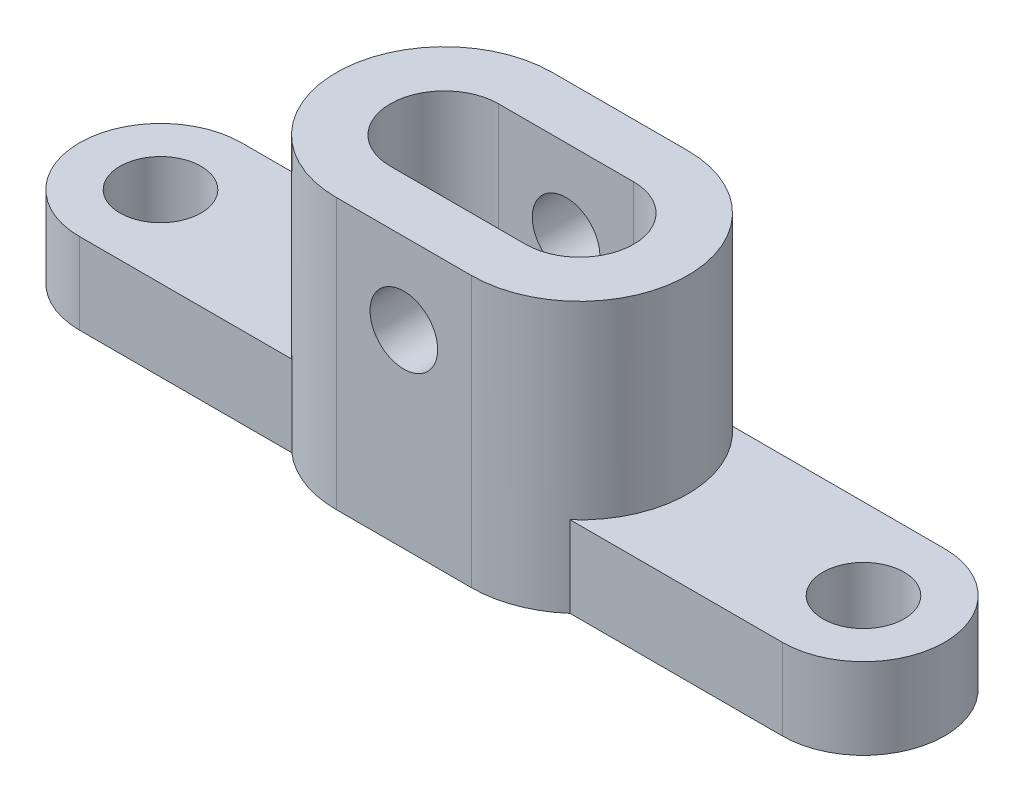
ISO-10303-21;
HEADER;
FILE_DESCRIPTION(('STEP AP214'),'2;1');
FILE_NAME('part.step','',(''),(''),'','','');
FILE_SCHEMA(('AUTOMOTIVE_DESIGN { 1 0 10303 214 1 1 1 1 }'));
ENDSEC;
DATA;
#1=APPLICATION_CONTEXT('core data for automotive mechanical design processes');
#2=APPLICATION_PROTOCOL_DEFINITION('international standard','automotive_design',2000,#1);
#3=PRODUCT_CONTEXT('',#1,'mechanical');
#4=PRODUCT('Part','Part','',(#3));
#5=PRODUCT_RELATED_PRODUCT_CATEGORY('part','',(#4));
#6=PRODUCT_DEFINITION_FORMATION('','',#4);
#7=PRODUCT_DEFINITION_CONTEXT('part definition',#1,'design');
#8=PRODUCT_DEFINITION('design','',#6,#7);
#9=PRODUCT_DEFINITION_SHAPE('','',#8);
#10=(LENGTH_UNIT() NAMED_UNIT(*) SI_UNIT(.MILLI.,.METRE.));
#11=(NAMED_UNIT(*) PLANE_ANGLE_UNIT() SI_UNIT($,.RADIAN.));
#12=(NAMED_UNIT(*) SI_UNIT($,.STERADIAN.) SOLID_ANGLE_UNIT());
#13=UNCERTAINTY_MEASURE_WITH_UNIT(LENGTH_MEASURE(1.E-05),#10,'distance_accuracy_value','');
#14=(GEOMETRIC_REPRESENTATION_CONTEXT(3) GLOBAL_UNCERTAINTY_ASSIGNED_CONTEXT((#13)) GLOBAL_UNIT_ASSIGNED_CONTEXT((#10,
#11,#12)) REPRESENTATION_CONTEXT('',''));
#15=CARTESIAN_POINT('',(0.,0.,0.));
#16=DIRECTION('',(0.,0.,1.));
#17=DIRECTION('',(1.,0.,0.));
#18=AXIS2_PLACEMENT_3D('',#15,#16,#17);
#19=CARTESIAN_POINT('',(13.,7.,4.));
#20=DIRECTION('',(0.,0.,-1.));
#21=DIRECTION('',(-1.,0.,0.));
#22=AXIS2_PLACEMENT_3D('',#19,#20,#21);
#23=CYLINDRICAL_SURFACE('',#22,1.25);
#24=CARTESIAN_POINT('',(13.,7.,-2.));
#25=DIRECTION('',(0.,0.,-1.));
#26=DIRECTION('',(-1.,0.,0.));
#27=AXIS2_PLACEMENT_3D('',#24,#25,#26);
#28=CIRCLE('',#27,1.25);
#29=CARTESIAN_POINT('',(11.75,7.,-2.));
#30=VERTEX_POINT('',#29);
#31=EDGE_CURVE('E40',#30,#30,#28,.F.);
#32=ORIENTED_EDGE('',*,*,#31,.T.);
#33=EDGE_LOOP('',(#32));
#34=FACE_BOUND('',#33,.T.);
#35=CARTESIAN_POINT('',(13.,7.,-4.));
#36=DIRECTION('',(0.,0.,-1.));
#37=DIRECTION('',(-1.,0.,0.));
#38=AXIS2_PLACEMENT_3D('',#35,#36,#37);
#39=CIRCLE('',#38,1.25);
#40=CARTESIAN_POINT('',(11.75,7.,-4.));
#41=VERTEX_POINT('',#40);
#42=EDGE_CURVE('E193',#41,#41,#39,.T.);
#43=ORIENTED_EDGE('',*,*,#42,.T.);
#44=EDGE_LOOP('',(#43));
#45=FACE_BOUND('',#44,.T.);
#46=ADVANCED_FACE('F36',(#34,#45),#23,.F.);
#47=CARTESIAN_POINT('',(0.,3.,0.));
#48=DIRECTION('',(0.,1.,0.));
#49=DIRECTION('',(0.,0.,1.));
#50=AXIS2_PLACEMENT_3D('',#47,#48,#49);
#51=PLANE('',#50);
#52=CARTESIAN_POINT('',(10.5,3.,0.));
#53=DIRECTION('',(0.,1.,0.));
#54=DIRECTION('',(0.,0.,1.));
#55=AXIS2_PLACEMENT_3D('',#52,#53,#54);
#56=CIRCLE('',#55,4.);
#57=CARTESIAN_POINT('',(7.8542486889354,3.,-3.));
#58=VERTEX_POINT('',#57);
#59=CARTESIAN_POINT('',(7.8542486889354,3.,3.));
#60=VERTEX_POINT('',#59);
#61=EDGE_CURVE('E236',#58,#60,#56,.T.);
#62=ORIENTED_EDGE('',*,*,#61,.F.);
#63=DIRECTION('',(-1.,0.,0.));
#64=VECTOR('',#63,1.);
#65=CARTESIAN_POINT('',(0.,3.,-3.));
#66=LINE('',#65,#64);
#67=CARTESIAN_POINT('',(0.,3.,-3.));
#68=VERTEX_POINT('',#67);
#69=EDGE_CURVE('E264',#58,#68,#66,.T.);
#70=ORIENTED_EDGE('',*,*,#69,.T.);
#71=CARTESIAN_POINT('',(0.,3.,0.));
#72=DIRECTION('',(0.,1.,0.));
#73=DIRECTION('',(0.,0.,1.));
#74=AXIS2_PLACEMENT_3D('',#71,#72,#73);
#75=CIRCLE('',#74,3.);
#76=CARTESIAN_POINT('',(0.,3.,3.));
#77=VERTEX_POINT('',#76);
#78=EDGE_CURVE('E254',#68,#77,#75,.T.);
#79=ORIENTED_EDGE('',*,*,#78,.T.);
#80=DIRECTION('',(1.,0.,0.));
#81=VECTOR('',#80,1.);
#82=CARTESIAN_POINT('',(0.,3.,3.));
#83=LINE('',#82,#81);
#84=EDGE_CURVE('E259',#77,#60,#83,.T.);
#85=ORIENTED_EDGE('',*,*,#84,.T.);
#86=EDGE_LOOP('',(#62,#70,#79,#85));
#87=FACE_BOUND('',#86,.T.);
#88=CARTESIAN_POINT('',(0.,3.,0.));
#89=DIRECTION('',(0.,1.,0.));
#90=DIRECTION('',(0.,0.,1.));
#91=AXIS2_PLACEMENT_3D('',#88,#89,#90);
#92=CIRCLE('',#91,1.5);
#93=CARTESIAN_POINT('',(0.,3.,1.5));
#94=VERTEX_POINT('',#93);
#95=EDGE_CURVE('E248',#94,#94,#92,.T.);
#96=ORIENTED_EDGE('',*,*,#95,.F.);
#97=EDGE_LOOP('',(#96));
#98=FACE_BOUND('',#97,.T.);
#99=ADVANCED_FACE('F311',(#87,#98),#51,.T.);
#100=CARTESIAN_POINT('',(0.,3.,3.));
#101=DIRECTION('',(0.,0.,-1.));
#102=DIRECTION('',(-1.,0.,0.));
#103=AXIS2_PLACEMENT_3D('',#100,#101,#102);
#104=PLANE('',#103);
#105=DIRECTION('',(1.,0.,0.));
#106=VECTOR('',#105,1.);
#107=CARTESIAN_POINT('',(0.,0.,3.));
#108=LINE('',#107,#106);
#109=CARTESIAN_POINT('',(0.,0.,3.));
#110=VERTEX_POINT('',#109);
#111=CARTESIAN_POINT('',(7.8542486889354,0.,3.));
#112=VERTEX_POINT('',#111);
#113=EDGE_CURVE('E272',#110,#112,#108,.T.);
#114=ORIENTED_EDGE('',*,*,#113,.T.);
#115=DIRECTION('',(0.,-1.,0.));
#116=VECTOR('',#115,1.);
#117=CARTESIAN_POINT('',(7.85424868893541,10.,3.));
#118=LINE('',#117,#116);
#119=EDGE_CURVE('E239',#112,#60,#118,.F.);
#120=ORIENTED_EDGE('',*,*,#119,.T.);
#121=ORIENTED_EDGE('',*,*,#84,.F.);
#122=DIRECTION('',(0.,-1.,0.));
#123=VECTOR('',#122,1.);
#124=CARTESIAN_POINT('',(0.,3.,3.));
#125=LINE('',#124,#123);
#126=EDGE_CURVE('E286',#77,#110,#125,.T.);
#127=ORIENTED_EDGE('',*,*,#126,.T.);
#128=EDGE_LOOP('',(#114,#120,#121,#127));
#129=FACE_BOUND('',#128,.T.);
#130=ADVANCED_FACE('F315',(#129),#104,.F.);
#131=CARTESIAN_POINT('',(0.,3.,-3.));
#132=DIRECTION('',(0.,0.,1.));
#133=DIRECTION('',(1.,0.,0.));
#134=AXIS2_PLACEMENT_3D('',#131,#132,#133);
#135=PLANE('',#134);
#136=ORIENTED_EDGE('',*,*,#69,.F.);
#137=DIRECTION('',(0.,-1.,0.));
#138=VECTOR('',#137,1.);
#139=CARTESIAN_POINT('',(7.85424868893541,10.,-3.));
#140=LINE('',#139,#138);
#141=CARTESIAN_POINT('',(7.85424868893541,0.,-3.));
#142=VERTEX_POINT('',#141);
#143=EDGE_CURVE('E11',#58,#142,#140,.T.);
#144=ORIENTED_EDGE('',*,*,#143,.T.);
#145=DIRECTION('',(-1.,0.,0.));
#146=VECTOR('',#145,1.);
#147=CARTESIAN_POINT('',(0.,0.,-3.));
#148=LINE('',#147,#146);
#149=CARTESIAN_POINT('',(0.,0.,-3.));
#150=VERTEX_POINT('',#149);
#151=EDGE_CURVE('E276',#142,#150,#148,.T.);
#152=ORIENTED_EDGE('',*,*,#151,.T.);
#153=DIRECTION('',(0.,-1.,0.));
#154=VECTOR('',#153,1.);
#155=CARTESIAN_POINT('',(0.,3.,-3.));
#156=LINE('',#155,#154);
#157=EDGE_CURVE('E268',#68,#150,#156,.T.);
#158=ORIENTED_EDGE('',*,*,#157,.F.);
#159=EDGE_LOOP('',(#136,#144,#152,#158));
#160=FACE_BOUND('',#159,.T.);
#161=ADVANCED_FACE('F350',(#160),#135,.F.);
#162=CARTESIAN_POINT('',(15.5,3.,0.));
#163=DIRECTION('',(0.,1.,0.));
#164=DIRECTION('',(0.,0.,1.));
#165=AXIS2_PLACEMENT_3D('',#162,#163,#164);
#166=CIRCLE('',#165,4.);
#167=CARTESIAN_POINT('',(18.1457513110646,3.,3.));
#168=VERTEX_POINT('',#167);
#169=CARTESIAN_POINT('',(18.1457513110646,3.,-3.));
#170=VERTEX_POINT('',#169);
#171=EDGE_CURVE('E224',#168,#170,#166,.T.);
#172=ORIENTED_EDGE('',*,*,#171,.F.);
#173=CARTESIAN_POINT('',(26.,3.,3.));
#174=VERTEX_POINT('',#173);
#175=EDGE_CURVE('E257',#168,#174,#83,.T.);
#176=ORIENTED_EDGE('',*,*,#175,.T.);
#177=CARTESIAN_POINT('',(26.,3.,0.));
#178=DIRECTION('',(0.,1.,0.));
#179=DIRECTION('',(0.,0.,1.));
#180=AXIS2_PLACEMENT_3D('',#177,#178,#179);
#181=CIRCLE('',#180,3.);
#182=CARTESIAN_POINT('',(26.,3.,-3.));
#183=VERTEX_POINT('',#182);
#184=EDGE_CURVE('E262',#174,#183,#181,.T.);
#185=ORIENTED_EDGE('',*,*,#184,.T.);
#186=EDGE_CURVE('E265',#183,#170,#66,.T.);
#187=ORIENTED_EDGE('',*,*,#186,.T.);
#188=EDGE_LOOP('',(#172,#176,#185,#187));
#189=FACE_BOUND('',#188,.T.);
#190=CARTESIAN_POINT('',(26.,3.,0.));
#191=DIRECTION('',(0.,1.,0.));
#192=DIRECTION('',(0.,0.,1.));
#193=AXIS2_PLACEMENT_3D('',#190,#191,#192);
#194=CIRCLE('',#193,1.5);
#195=CARTESIAN_POINT('',(26.,3.,1.5));
#196=VERTEX_POINT('',#195);
#197=EDGE_CURVE('E242',#196,#196,#194,.T.);
#198=ORIENTED_EDGE('',*,*,#197,.F.);
#199=EDGE_LOOP('',(#198));
#200=FACE_BOUND('',#199,.T.);
#201=ADVANCED_FACE('F318',(#189,#200),#51,.T.);
#202=CARTESIAN_POINT('',(0.,0.,0.));
#203=DIRECTION('',(0.,1.,0.));
#204=DIRECTION('',(0.,0.,1.));
#205=AXIS2_PLACEMENT_3D('',#202,#203,#204);
#206=PLANE('',#205);
#207=DIRECTION('',(-1.,0.,0.));
#208=VECTOR('',#207,1.);
#209=CARTESIAN_POINT('',(15.5,0.,-2.));
#210=LINE('',#209,#208);
#211=CARTESIAN_POINT('',(15.5,0.,-2.));
#212=VERTEX_POINT('',#211);
#213=CARTESIAN_POINT('',(10.5,0.,-2.));
#214=VERTEX_POINT('',#213);
#215=EDGE_CURVE('E159',#212,#214,#210,.T.);
#216=ORIENTED_EDGE('',*,*,#215,.T.);
#217=CARTESIAN_POINT('',(10.5,0.,0.));
#218=DIRECTION('',(0.,1.,0.));
#219=DIRECTION('',(0.,0.,1.));
#220=AXIS2_PLACEMENT_3D('',#217,#218,#219);
#221=CIRCLE('',#220,2.);
#222=CARTESIAN_POINT('',(10.5,0.,2.));
#223=VERTEX_POINT('',#222);
#224=EDGE_CURVE('E153',#214,#223,#221,.T.);
#225=ORIENTED_EDGE('',*,*,#224,.T.);
#226=DIRECTION('',(1.,0.,0.));
#227=VECTOR('',#226,1.);
#228=CARTESIAN_POINT('',(10.5,0.,2.));
#229=LINE('',#228,#227);
#230=CARTESIAN_POINT('',(15.5,0.,2.));
#231=VERTEX_POINT('',#230);
#232=EDGE_CURVE('E162',#223,#231,#229,.T.);
#233=ORIENTED_EDGE('',*,*,#232,.T.);
#234=CARTESIAN_POINT('',(15.5,0.,0.));
#235=DIRECTION('',(0.,1.,0.));
#236=DIRECTION('',(0.,0.,1.));
#237=AXIS2_PLACEMENT_3D('',#234,#235,#236);
#238=CIRCLE('',#237,2.);
#239=EDGE_CURVE('E53',#231,#212,#238,.T.);
#240=ORIENTED_EDGE('',*,*,#239,.T.);
#241=EDGE_LOOP('',(#216,#225,#233,#240));
#242=FACE_BOUND('',#241,.T.);
#243=CARTESIAN_POINT('',(18.1457513110646,0.,3.));
#244=VERTEX_POINT('',#243);
#245=CARTESIAN_POINT('',(26.,0.,3.));
#246=VERTEX_POINT('',#245);
#247=EDGE_CURVE('E271',#244,#246,#108,.T.);
#248=ORIENTED_EDGE('',*,*,#247,.F.);
#249=CARTESIAN_POINT('',(15.5,0.,0.));
#250=DIRECTION('',(0.,-1.,0.));
#251=DIRECTION('',(0.,0.,-1.));
#252=AXIS2_PLACEMENT_3D('',#249,#250,#251);
#253=CIRCLE('',#252,4.);
#254=CARTESIAN_POINT('',(15.5,0.,4.));
#255=VERTEX_POINT('',#254);
#256=EDGE_CURVE('E216',#244,#255,#253,.T.);
#257=ORIENTED_EDGE('',*,*,#256,.T.);
#258=DIRECTION('',(-1.,0.,0.));
#259=VECTOR('',#258,1.);
#260=CARTESIAN_POINT('',(10.5,0.,4.));
#261=LINE('',#260,#259);
#262=CARTESIAN_POINT('',(10.5,0.,4.));
#263=VERTEX_POINT('',#262);
#264=EDGE_CURVE('E200',#255,#263,#261,.T.);
#265=ORIENTED_EDGE('',*,*,#264,.T.);
#266=CARTESIAN_POINT('',(10.5,0.,0.));
#267=DIRECTION('',(0.,-1.,0.));
#268=DIRECTION('',(0.,0.,-1.));
#269=AXIS2_PLACEMENT_3D('',#266,#267,#268);
#270=CIRCLE('',#269,4.);
#271=EDGE_CURVE('E210',#263,#112,#270,.T.);
#272=ORIENTED_EDGE('',*,*,#271,.T.);
#273=ORIENTED_EDGE('',*,*,#113,.F.);
#274=CARTESIAN_POINT('',(0.,0.,0.));
#275=DIRECTION('',(0.,1.,0.));
#276=DIRECTION('',(0.,0.,1.));
#277=AXIS2_PLACEMENT_3D('',#274,#275,#276);
#278=CIRCLE('',#277,3.);
#279=EDGE_CURVE('E251',#150,#110,#278,.T.);
#280=ORIENTED_EDGE('',*,*,#279,.F.);
#281=ORIENTED_EDGE('',*,*,#151,.F.);
#282=CARTESIAN_POINT('',(10.5,0.,-4.));
#283=VERTEX_POINT('',#282);
#284=EDGE_CURVE('E192',#142,#283,#270,.T.);
#285=ORIENTED_EDGE('',*,*,#284,.T.);
#286=DIRECTION('',(1.,0.,0.));
#287=VECTOR('',#286,1.);
#288=CARTESIAN_POINT('',(10.5,0.,-4.));
#289=LINE('',#288,#287);
#290=CARTESIAN_POINT('',(15.5,0.,-4.));
#291=VERTEX_POINT('',#290);
#292=EDGE_CURVE('E213',#283,#291,#289,.T.);
#293=ORIENTED_EDGE('',*,*,#292,.T.);
#294=CARTESIAN_POINT('',(18.1457513110646,0.,-3.));
#295=VERTEX_POINT('',#294);
#296=EDGE_CURVE('E217',#291,#295,#253,.T.);
#297=ORIENTED_EDGE('',*,*,#296,.T.);
#298=CARTESIAN_POINT('',(26.,0.,-3.));
#299=VERTEX_POINT('',#298);
#300=EDGE_CURVE('E258',#299,#295,#148,.T.);
#301=ORIENTED_EDGE('',*,*,#300,.F.);
#302=CARTESIAN_POINT('',(26.,0.,0.));
#303=DIRECTION('',(0.,1.,0.));
#304=DIRECTION('',(0.,0.,1.));
#305=AXIS2_PLACEMENT_3D('',#302,#303,#304);
#306=CIRCLE('',#305,3.);
#307=EDGE_CURVE('E274',#246,#299,#306,.T.);
#308=ORIENTED_EDGE('',*,*,#307,.F.);
#309=EDGE_LOOP('',(#248,#257,#265,#272,#273,#280,#281,#285,#293,#297,#301,#308));
#310=FACE_BOUND('',#309,.T.);
#311=CARTESIAN_POINT('',(26.,0.,0.));
#312=DIRECTION('',(0.,1.,0.));
#313=DIRECTION('',(0.,0.,1.));
#314=AXIS2_PLACEMENT_3D('',#311,#312,#313);
#315=CIRCLE('',#314,1.5);
#316=CARTESIAN_POINT('',(26.,0.,1.5));
#317=VERTEX_POINT('',#316);
#318=EDGE_CURVE('E241',#317,#317,#315,.T.);
#319=ORIENTED_EDGE('',*,*,#318,.T.);
#320=EDGE_LOOP('',(#319));
#321=FACE_BOUND('',#320,.T.);
#322=CARTESIAN_POINT('',(0.,0.,0.));
#323=DIRECTION('',(0.,1.,0.));
#324=DIRECTION('',(0.,0.,1.));
#325=AXIS2_PLACEMENT_3D('',#322,#323,#324);
#326=CIRCLE('',#325,1.5);
#327=CARTESIAN_POINT('',(0.,0.,1.5));
#328=VERTEX_POINT('',#327);
#329=EDGE_CURVE('E245',#328,#328,#326,.T.);
#330=ORIENTED_EDGE('',*,*,#329,.T.);
#331=EDGE_LOOP('',(#330));
#332=FACE_BOUND('',#331,.T.);
#333=ADVANCED_FACE('F167',(#242,#310,#321,#332),#206,.F.);
#334=CARTESIAN_POINT('',(0.,3.,0.));
#335=DIRECTION('',(0.,-1.,0.));
#336=DIRECTION('',(0.,0.,-1.));
#337=AXIS2_PLACEMENT_3D('',#334,#335,#336);
#338=CYLINDRICAL_SURFACE('',#337,3.);
#339=ORIENTED_EDGE('',*,*,#279,.T.);
#340=ORIENTED_EDGE('',*,*,#126,.F.);
#341=ORIENTED_EDGE('',*,*,#78,.F.);
#342=ORIENTED_EDGE('',*,*,#157,.T.);
#343=EDGE_LOOP('',(#339,#340,#341,#342));
#344=FACE_BOUND('',#343,.T.);
#345=ADVANCED_FACE('F38',(#344),#338,.T.);
#346=ORIENTED_EDGE('',*,*,#175,.F.);
#347=DIRECTION('',(0.,-1.,0.));
#348=VECTOR('',#347,1.);
#349=CARTESIAN_POINT('',(18.1457513110646,10.,3.));
#350=LINE('',#349,#348);
#351=EDGE_CURVE('E234',#168,#244,#350,.T.);
#352=ORIENTED_EDGE('',*,*,#351,.T.);
#353=ORIENTED_EDGE('',*,*,#247,.T.);
#354=DIRECTION('',(0.,-1.,0.));
#355=VECTOR('',#354,1.);
#356=CARTESIAN_POINT('',(26.,3.,3.));
#357=LINE('',#356,#355);
#358=EDGE_CURVE('E283',#174,#246,#357,.T.);
#359=ORIENTED_EDGE('',*,*,#358,.F.);
#360=EDGE_LOOP('',(#346,#352,#353,#359));
#361=FACE_BOUND('',#360,.T.);
#362=ADVANCED_FACE('F359',(#361),#104,.F.);
#363=CARTESIAN_POINT('',(26.,3.,0.));
#364=DIRECTION('',(0.,-1.,0.));
#365=DIRECTION('',(0.,0.,-1.));
#366=AXIS2_PLACEMENT_3D('',#363,#364,#365);
#367=CYLINDRICAL_SURFACE('',#366,3.);
#368=ORIENTED_EDGE('',*,*,#307,.T.);
#369=DIRECTION('',(0.,-1.,0.));
#370=VECTOR('',#369,1.);
#371=CARTESIAN_POINT('',(26.,3.,-3.));
#372=LINE('',#371,#370);
#373=EDGE_CURVE('E280',#183,#299,#372,.T.);
#374=ORIENTED_EDGE('',*,*,#373,.F.);
#375=ORIENTED_EDGE('',*,*,#184,.F.);
#376=ORIENTED_EDGE('',*,*,#358,.T.);
#377=EDGE_LOOP('',(#368,#374,#375,#376));
#378=FACE_BOUND('',#377,.T.);
#379=ADVANCED_FACE('F356',(#378),#367,.T.);
#380=ORIENTED_EDGE('',*,*,#300,.T.);
#381=DIRECTION('',(0.,-1.,0.));
#382=VECTOR('',#381,1.);
#383=CARTESIAN_POINT('',(18.1457513110646,10.,-3.));
#384=LINE('',#383,#382);
#385=EDGE_CURVE('E45',#295,#170,#384,.F.);
#386=ORIENTED_EDGE('',*,*,#385,.T.);
#387=ORIENTED_EDGE('',*,*,#186,.F.);
#388=ORIENTED_EDGE('',*,*,#373,.T.);
#389=EDGE_LOOP('',(#380,#386,#387,#388));
#390=FACE_BOUND('',#389,.T.);
#391=ADVANCED_FACE('F346',(#390),#135,.F.);
#392=CARTESIAN_POINT('',(0.,3.,0.));
#393=DIRECTION('',(0.,-1.,0.));
#394=DIRECTION('',(0.,0.,-1.));
#395=AXIS2_PLACEMENT_3D('',#392,#393,#394);
#396=CYLINDRICAL_SURFACE('',#395,1.5);
#397=ORIENTED_EDGE('',*,*,#95,.T.);
#398=EDGE_LOOP('',(#397));
#399=FACE_BOUND('',#398,.T.);
#400=ORIENTED_EDGE('',*,*,#329,.F.);
#401=EDGE_LOOP('',(#400));
#402=FACE_BOUND('',#401,.T.);
#403=ADVANCED_FACE('F343',(#399,#402),#396,.F.);
#404=CARTESIAN_POINT('',(26.,3.,0.));
#405=DIRECTION('',(0.,-1.,0.));
#406=DIRECTION('',(0.,0.,-1.));
#407=AXIS2_PLACEMENT_3D('',#404,#405,#406);
#408=CYLINDRICAL_SURFACE('',#407,1.5);
#409=ORIENTED_EDGE('',*,*,#197,.T.);
#410=EDGE_LOOP('',(#409));
#411=FACE_BOUND('',#410,.T.);
#412=ORIENTED_EDGE('',*,*,#318,.F.);
#413=EDGE_LOOP('',(#412));
#414=FACE_BOUND('',#413,.T.);
#415=ADVANCED_FACE('F339',(#411,#414),#408,.F.);
#416=CARTESIAN_POINT('',(10.5,10.,0.));
#417=DIRECTION('',(0.,-1.,0.));
#418=DIRECTION('',(0.,0.,-1.));
#419=AXIS2_PLACEMENT_3D('',#416,#417,#418);
#420=CYLINDRICAL_SURFACE('',#419,4.);
#421=ORIENTED_EDGE('',*,*,#119,.F.);
#422=ORIENTED_EDGE('',*,*,#271,.F.);
#423=DIRECTION('',(0.,-1.,0.));
#424=VECTOR('',#423,1.);
#425=CARTESIAN_POINT('',(10.5,10.,4.));
#426=LINE('',#425,#424);
#427=CARTESIAN_POINT('',(10.5,10.,4.));
#428=VERTEX_POINT('',#427);
#429=EDGE_CURVE('E222',#428,#263,#426,.T.);
#430=ORIENTED_EDGE('',*,*,#429,.F.);
#431=CARTESIAN_POINT('',(10.5,10.,0.));
#432=DIRECTION('',(0.,-1.,0.));
#433=DIRECTION('',(0.,0.,-1.));
#434=AXIS2_PLACEMENT_3D('',#431,#432,#433);
#435=CIRCLE('',#434,4.);
#436=CARTESIAN_POINT('',(10.5,10.,-4.));
#437=VERTEX_POINT('',#436);
#438=EDGE_CURVE('E196',#428,#437,#435,.T.);
#439=ORIENTED_EDGE('',*,*,#438,.T.);
#440=DIRECTION('',(0.,-1.,0.));
#441=VECTOR('',#440,1.);
#442=CARTESIAN_POINT('',(10.5,10.,-4.));
#443=LINE('',#442,#441);
#444=EDGE_CURVE('E209',#437,#283,#443,.T.);
#445=ORIENTED_EDGE('',*,*,#444,.T.);
#446=ORIENTED_EDGE('',*,*,#284,.F.);
#447=ORIENTED_EDGE('',*,*,#143,.F.);
#448=ORIENTED_EDGE('',*,*,#61,.T.);
#449=EDGE_LOOP('',(#421,#422,#430,#439,#445,#446,#447,#448));
#450=FACE_BOUND('',#449,.T.);
#451=ADVANCED_FACE('F332',(#450),#420,.T.);
#452=CARTESIAN_POINT('',(15.5,10.,0.));
#453=DIRECTION('',(0.,-1.,0.));
#454=DIRECTION('',(0.,0.,-1.));
#455=AXIS2_PLACEMENT_3D('',#452,#453,#454);
#456=CYLINDRICAL_SURFACE('',#455,4.);
#457=ORIENTED_EDGE('',*,*,#351,.F.);
#458=ORIENTED_EDGE('',*,*,#171,.T.);
#459=ORIENTED_EDGE('',*,*,#385,.F.);
#460=ORIENTED_EDGE('',*,*,#296,.F.);
#461=DIRECTION('',(0.,-1.,0.));
#462=VECTOR('',#461,1.);
#463=CARTESIAN_POINT('',(15.5,10.,-4.));
#464=LINE('',#463,#462);
#465=CARTESIAN_POINT('',(15.5,10.,-4.));
#466=VERTEX_POINT('',#465);
#467=EDGE_CURVE('E228',#466,#291,#464,.T.);
#468=ORIENTED_EDGE('',*,*,#467,.F.);
#469=CARTESIAN_POINT('',(15.5,10.,0.));
#470=DIRECTION('',(0.,-1.,0.));
#471=DIRECTION('',(0.,0.,-1.));
#472=AXIS2_PLACEMENT_3D('',#469,#470,#471);
#473=CIRCLE('',#472,4.);
#474=CARTESIAN_POINT('',(15.5,10.,4.));
#475=VERTEX_POINT('',#474);
#476=EDGE_CURVE('E203',#466,#475,#473,.T.);
#477=ORIENTED_EDGE('',*,*,#476,.T.);
#478=DIRECTION('',(0.,-1.,0.));
#479=VECTOR('',#478,1.);
#480=CARTESIAN_POINT('',(15.5,10.,4.));
#481=LINE('',#480,#479);
#482=EDGE_CURVE('E225',#475,#255,#481,.T.);
#483=ORIENTED_EDGE('',*,*,#482,.T.);
#484=ORIENTED_EDGE('',*,*,#256,.F.);
#485=EDGE_LOOP('',(#457,#458,#459,#460,#468,#477,#483,#484));
#486=FACE_BOUND('',#485,.T.);
#487=ADVANCED_FACE('F328',(#486),#456,.T.);
#488=CARTESIAN_POINT('',(10.5,10.,4.));
#489=DIRECTION('',(0.,0.,1.));
#490=DIRECTION('',(1.,0.,0.));
#491=AXIS2_PLACEMENT_3D('',#488,#489,#490);
#492=PLANE('',#491);
#493=CARTESIAN_POINT('',(13.,7.,4.));
#494=DIRECTION('',(0.,0.,-1.));
#495=DIRECTION('',(-1.,0.,0.));
#496=AXIS2_PLACEMENT_3D('',#493,#494,#495);
#497=CIRCLE('',#496,1.25);
#498=CARTESIAN_POINT('',(11.75,7.,4.));
#499=VERTEX_POINT('',#498);
#500=EDGE_CURVE('E189',#499,#499,#497,.T.);
#501=ORIENTED_EDGE('',*,*,#500,.T.);
#502=EDGE_LOOP('',(#501));
#503=FACE_BOUND('',#502,.T.);
#504=ORIENTED_EDGE('',*,*,#264,.F.);
#505=ORIENTED_EDGE('',*,*,#482,.F.);
#506=DIRECTION('',(-1.,0.,0.));
#507=VECTOR('',#506,1.);
#508=CARTESIAN_POINT('',(10.5,10.,4.));
#509=LINE('',#508,#507);
#510=EDGE_CURVE('E206',#475,#428,#509,.T.);
#511=ORIENTED_EDGE('',*,*,#510,.T.);
#512=ORIENTED_EDGE('',*,*,#429,.T.);
#513=EDGE_LOOP('',(#504,#505,#511,#512));
#514=FACE_BOUND('',#513,.T.);
#515=ADVANCED_FACE('F325',(#503,#514),#492,.T.);
#516=CARTESIAN_POINT('',(10.5,10.,-4.));
#517=DIRECTION('',(0.,0.,-1.));
#518=DIRECTION('',(-1.,0.,0.));
#519=AXIS2_PLACEMENT_3D('',#516,#517,#518);
#520=PLANE('',#519);
#521=ORIENTED_EDGE('',*,*,#42,.F.);
#522=EDGE_LOOP('',(#521));
#523=FACE_BOUND('',#522,.T.);
#524=ORIENTED_EDGE('',*,*,#292,.F.);
#525=ORIENTED_EDGE('',*,*,#444,.F.);
#526=DIRECTION('',(1.,0.,0.));
#527=VECTOR('',#526,1.);
#528=CARTESIAN_POINT('',(10.5,10.,-4.));
#529=LINE('',#528,#527);
#530=EDGE_CURVE('E199',#437,#466,#529,.T.);
#531=ORIENTED_EDGE('',*,*,#530,.T.);
#532=ORIENTED_EDGE('',*,*,#467,.T.);
#533=EDGE_LOOP('',(#524,#525,#531,#532));
#534=FACE_BOUND('',#533,.T.);
#535=ADVANCED_FACE('F323',(#523,#534),#520,.T.);
#536=CARTESIAN_POINT('',(10.5,10.,0.));
#537=DIRECTION('',(0.,-1.,0.));
#538=DIRECTION('',(0.,0.,-1.));
#539=AXIS2_PLACEMENT_3D('',#536,#537,#538);
#540=PLANE('',#539);
#541=DIRECTION('',(1.,0.,0.));
#542=VECTOR('',#541,1.);
#543=CARTESIAN_POINT('',(10.5,10.,2.));
#544=LINE('',#543,#542);
#545=CARTESIAN_POINT('',(10.5,10.,2.));
#546=VERTEX_POINT('',#545);
#547=CARTESIAN_POINT('',(15.5,10.,2.));
#548=VERTEX_POINT('',#547);
#549=EDGE_CURVE('E179',#546,#548,#544,.T.);
#550=ORIENTED_EDGE('',*,*,#549,.F.);
#551=CARTESIAN_POINT('',(10.5,10.,0.));
#552=DIRECTION('',(0.,1.,0.));
#553=DIRECTION('',(0.,0.,1.));
#554=AXIS2_PLACEMENT_3D('',#551,#552,#553);
#555=CIRCLE('',#554,2.);
#556=CARTESIAN_POINT('',(10.5,10.,-2.));
#557=VERTEX_POINT('',#556);
#558=EDGE_CURVE('E61',#557,#546,#555,.T.);
#559=ORIENTED_EDGE('',*,*,#558,.F.);
#560=DIRECTION('',(-1.,0.,0.));
#561=VECTOR('',#560,1.);
#562=CARTESIAN_POINT('',(15.5,10.,-2.));
#563=LINE('',#562,#561);
#564=CARTESIAN_POINT('',(15.5,10.,-2.));
#565=VERTEX_POINT('',#564);
#566=EDGE_CURVE('E170',#565,#557,#563,.T.);
#567=ORIENTED_EDGE('',*,*,#566,.F.);
#568=CARTESIAN_POINT('',(15.5,10.,0.));
#569=DIRECTION('',(0.,1.,0.));
#570=DIRECTION('',(0.,0.,1.));
#571=AXIS2_PLACEMENT_3D('',#568,#569,#570);
#572=CIRCLE('',#571,2.);
#573=EDGE_CURVE('E173',#548,#565,#572,.T.);
#574=ORIENTED_EDGE('',*,*,#573,.F.);
#575=EDGE_LOOP('',(#550,#559,#567,#574));
#576=FACE_BOUND('',#575,.T.);
#577=ORIENTED_EDGE('',*,*,#438,.F.);
#578=ORIENTED_EDGE('',*,*,#510,.F.);
#579=ORIENTED_EDGE('',*,*,#476,.F.);
#580=ORIENTED_EDGE('',*,*,#530,.F.);
#581=EDGE_LOOP('',(#577,#578,#579,#580));
#582=FACE_BOUND('',#581,.T.);
#583=ADVANCED_FACE('F307',(#576,#582),#540,.F.);
#584=CARTESIAN_POINT('',(13.,7.,2.));
#585=DIRECTION('',(0.,0.,1.));
#586=DIRECTION('',(1.,0.,0.));
#587=AXIS2_PLACEMENT_3D('',#584,#585,#586);
#588=CIRCLE('',#587,1.25);
#589=CARTESIAN_POINT('',(14.25,7.,2.));
#590=VERTEX_POINT('',#589);
#591=EDGE_CURVE('E185',#590,#590,#588,.F.);
#592=ORIENTED_EDGE('',*,*,#591,.T.);
#593=EDGE_LOOP('',(#592));
#594=FACE_BOUND('',#593,.T.);
#595=ORIENTED_EDGE('',*,*,#500,.F.);
#596=EDGE_LOOP('',(#595));
#597=FACE_BOUND('',#596,.T.);
#598=ADVANCED_FACE('F299',(#594,#597),#23,.F.);
#599=CARTESIAN_POINT('',(15.5,0.,-2.));
#600=DIRECTION('',(0.,0.,-1.));
#601=DIRECTION('',(-1.,0.,0.));
#602=AXIS2_PLACEMENT_3D('',#599,#600,#601);
#603=PLANE('',#602);
#604=ORIENTED_EDGE('',*,*,#566,.T.);
#605=DIRECTION('',(0.,1.,0.));
#606=VECTOR('',#605,1.);
#607=CARTESIAN_POINT('',(10.5,0.,-2.));
#608=LINE('',#607,#606);
#609=EDGE_CURVE('E183',#214,#557,#608,.T.);
#610=ORIENTED_EDGE('',*,*,#609,.F.);
#611=ORIENTED_EDGE('',*,*,#215,.F.);
#612=DIRECTION('',(0.,1.,0.));
#613=VECTOR('',#612,1.);
#614=CARTESIAN_POINT('',(15.5,0.,-2.));
#615=LINE('',#614,#613);
#616=EDGE_CURVE('E186',#212,#565,#615,.T.);
#617=ORIENTED_EDGE('',*,*,#616,.T.);
#618=EDGE_LOOP('',(#604,#610,#611,#617));
#619=FACE_BOUND('',#618,.T.);
#620=ORIENTED_EDGE('',*,*,#31,.F.);
#621=EDGE_LOOP('',(#620));
#622=FACE_BOUND('',#621,.T.);
#623=ADVANCED_FACE('F297',(#619,#622),#603,.F.);
#624=CARTESIAN_POINT('',(10.5,0.,2.));
#625=DIRECTION('',(0.,0.,1.));
#626=DIRECTION('',(1.,0.,0.));
#627=AXIS2_PLACEMENT_3D('',#624,#625,#626);
#628=PLANE('',#627);
#629=ORIENTED_EDGE('',*,*,#549,.T.);
#630=DIRECTION('',(0.,1.,0.));
#631=VECTOR('',#630,1.);
#632=CARTESIAN_POINT('',(15.5,0.,2.));
#633=LINE('',#632,#631);
#634=EDGE_CURVE('E158',#231,#548,#633,.T.);
#635=ORIENTED_EDGE('',*,*,#634,.F.);
#636=ORIENTED_EDGE('',*,*,#232,.F.);
#637=DIRECTION('',(0.,1.,0.));
#638=VECTOR('',#637,1.);
#639=CARTESIAN_POINT('',(10.5,0.,2.));
#640=LINE('',#639,#638);
#641=EDGE_CURVE('E149',#223,#546,#640,.T.);
#642=ORIENTED_EDGE('',*,*,#641,.T.);
#643=EDGE_LOOP('',(#629,#635,#636,#642));
#644=FACE_BOUND('',#643,.T.);
#645=ORIENTED_EDGE('',*,*,#591,.F.);
#646=EDGE_LOOP('',(#645));
#647=FACE_BOUND('',#646,.T.);
#648=ADVANCED_FACE('F163',(#644,#647),#628,.F.);
#649=CARTESIAN_POINT('',(10.5,0.,0.));
#650=DIRECTION('',(0.,1.,0.));
#651=DIRECTION('',(0.,0.,1.));
#652=AXIS2_PLACEMENT_3D('',#649,#650,#651);
#653=CYLINDRICAL_SURFACE('',#652,2.);
#654=ORIENTED_EDGE('',*,*,#558,.T.);
#655=ORIENTED_EDGE('',*,*,#641,.F.);
#656=ORIENTED_EDGE('',*,*,#224,.F.);
#657=ORIENTED_EDGE('',*,*,#609,.T.);
#658=EDGE_LOOP('',(#654,#655,#656,#657));
#659=FACE_BOUND('',#658,.T.);
#660=ADVANCED_FACE('F151',(#659),#653,.F.);
#661=CARTESIAN_POINT('',(15.5,0.,0.));
#662=DIRECTION('',(0.,1.,0.));
#663=DIRECTION('',(0.,0.,1.));
#664=AXIS2_PLACEMENT_3D('',#661,#662,#663);
#665=CYLINDRICAL_SURFACE('',#664,2.);
#666=ORIENTED_EDGE('',*,*,#573,.T.);
#667=ORIENTED_EDGE('',*,*,#616,.F.);
#668=ORIENTED_EDGE('',*,*,#239,.F.);
#669=ORIENTED_EDGE('',*,*,#634,.T.);
#670=EDGE_LOOP('',(#666,#667,#668,#669));
#671=FACE_BOUND('',#670,.T.);
#672=ADVANCED_FACE('F518',(#671),#665,.F.);
#673=CLOSED_SHELL('',(#46,#99,#130,#161,#201,#333,#345,#362,#379,#391,#403,#415,#451,#487,#515,
#535,#583,#598,#623,#648,#660,#672));
#674=MANIFOLD_SOLID_BREP('B2',#673);
#675=ADVANCED_BREP_SHAPE_REPRESENTATION('',(#18,#674),#14);
#676=SHAPE_DEFINITION_REPRESENTATION(#9,#675);
ENDSEC;
END-ISO-10303-21;
